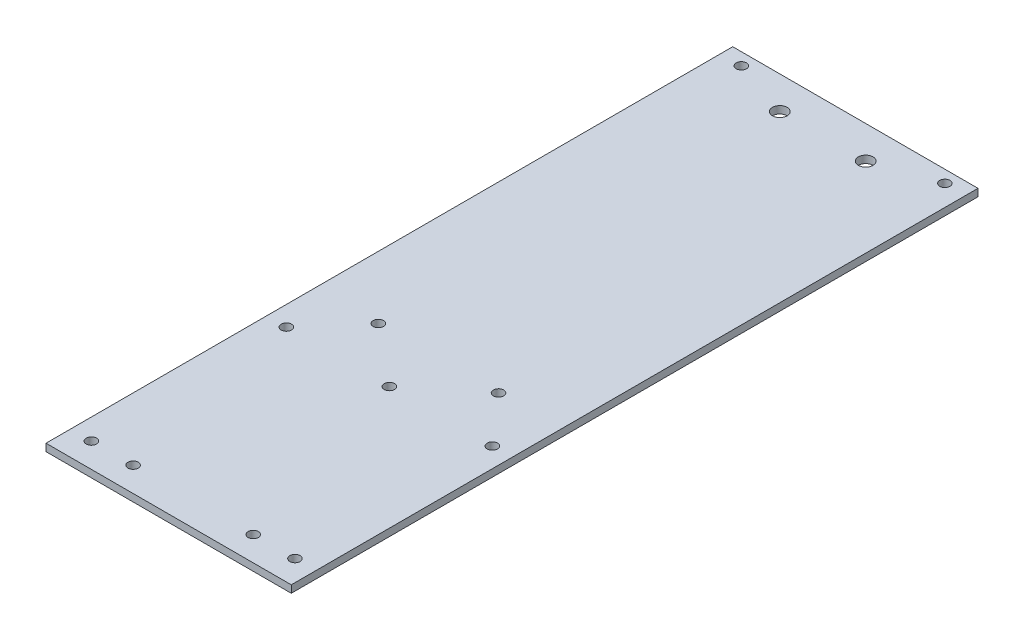
ISO-10303-21;
HEADER;
FILE_DESCRIPTION(('STEP AP214'),'2;1');
FILE_NAME('part.step','',(''),(''),'','','');
FILE_SCHEMA(('AUTOMOTIVE_DESIGN { 1 0 10303 214 1 1 1 1 }'));
ENDSEC;
DATA;
#1=APPLICATION_CONTEXT('core data for automotive mechanical design processes');
#2=APPLICATION_PROTOCOL_DEFINITION('international standard','automotive_design',2000,#1);
#3=PRODUCT_CONTEXT('',#1,'mechanical');
#4=PRODUCT('Part','Part','',(#3));
#5=PRODUCT_RELATED_PRODUCT_CATEGORY('part','',(#4));
#6=PRODUCT_DEFINITION_FORMATION('','',#4);
#7=PRODUCT_DEFINITION_CONTEXT('part definition',#1,'design');
#8=PRODUCT_DEFINITION('design','',#6,#7);
#9=PRODUCT_DEFINITION_SHAPE('','',#8);
#10=(LENGTH_UNIT() NAMED_UNIT(*) SI_UNIT(.MILLI.,.METRE.));
#11=(NAMED_UNIT(*) PLANE_ANGLE_UNIT() SI_UNIT($,.RADIAN.));
#12=(NAMED_UNIT(*) SI_UNIT($,.STERADIAN.) SOLID_ANGLE_UNIT());
#13=UNCERTAINTY_MEASURE_WITH_UNIT(LENGTH_MEASURE(1.E-05),#10,'distance_accuracy_value','');
#14=(GEOMETRIC_REPRESENTATION_CONTEXT(3) GLOBAL_UNCERTAINTY_ASSIGNED_CONTEXT((#13)) GLOBAL_UNIT_ASSIGNED_CONTEXT((#10,
#11,#12)) REPRESENTATION_CONTEXT('',''));
#15=CARTESIAN_POINT('',(0.,0.,0.));
#16=DIRECTION('',(0.,0.,1.));
#17=DIRECTION('',(1.,0.,0.));
#18=AXIS2_PLACEMENT_3D('',#15,#16,#17);
#19=CARTESIAN_POINT('',(0.,3.,0.));
#20=DIRECTION('',(0.,1.,0.));
#21=DIRECTION('',(0.,0.,1.));
#22=AXIS2_PLACEMENT_3D('',#19,#20,#21);
#23=PLANE('',#22);
#24=CARTESIAN_POINT('',(41.4999999999999,3.,-215.));
#25=DIRECTION('',(0.,1.,0.));
#26=DIRECTION('',(0.,0.,1.));
#27=AXIS2_PLACEMENT_3D('',#24,#25,#26);
#28=CIRCLE('',#27,2.09999999999999);
#29=CARTESIAN_POINT('',(41.4999999999999,3.,-212.9));
#30=VERTEX_POINT('',#29);
#31=EDGE_CURVE('E242',#30,#30,#28,.T.);
#32=ORIENTED_EDGE('',*,*,#31,.F.);
#33=EDGE_LOOP('',(#32));
#34=FACE_BOUND('',#33,.T.);
#35=CARTESIAN_POINT('',(-41.5000000000001,3.,-215.));
#36=DIRECTION('',(0.,1.,0.));
#37=DIRECTION('',(0.,0.,1.));
#38=AXIS2_PLACEMENT_3D('',#35,#36,#37);
#39=CIRCLE('',#38,2.09999999999999);
#40=CARTESIAN_POINT('',(-41.5000000000001,3.,-212.9));
#41=VERTEX_POINT('',#40);
#42=EDGE_CURVE('E252',#41,#41,#39,.T.);
#43=ORIENTED_EDGE('',*,*,#42,.F.);
#44=EDGE_LOOP('',(#43));
#45=FACE_BOUND('',#44,.T.);
#46=CARTESIAN_POINT('',(-17.5,3.,-206.7));
#47=DIRECTION('',(0.,1.,0.));
#48=DIRECTION('',(0.,0.,1.));
#49=AXIS2_PLACEMENT_3D('',#46,#47,#48);
#50=CIRCLE('',#49,3.);
#51=CARTESIAN_POINT('',(-17.5,3.,-203.7));
#52=VERTEX_POINT('',#51);
#53=EDGE_CURVE('E258',#52,#52,#50,.T.);
#54=ORIENTED_EDGE('',*,*,#53,.F.);
#55=EDGE_LOOP('',(#54));
#56=FACE_BOUND('',#55,.T.);
#57=CARTESIAN_POINT('',(17.5,3.,-206.7));
#58=DIRECTION('',(0.,1.,0.));
#59=DIRECTION('',(0.,0.,1.));
#60=AXIS2_PLACEMENT_3D('',#57,#58,#59);
#61=CIRCLE('',#60,3.);
#62=CARTESIAN_POINT('',(17.5,3.,-203.7));
#63=VERTEX_POINT('',#62);
#64=EDGE_CURVE('E93',#63,#63,#61,.T.);
#65=ORIENTED_EDGE('',*,*,#64,.F.);
#66=EDGE_LOOP('',(#65));
#67=FACE_BOUND('',#66,.T.);
#68=CARTESIAN_POINT('',(-24.5,3.,50.));
#69=DIRECTION('',(0.,1.,0.));
#70=DIRECTION('',(0.,0.,1.));
#71=AXIS2_PLACEMENT_3D('',#68,#69,#70);
#72=CIRCLE('',#71,2.1);
#73=CARTESIAN_POINT('',(-24.5,3.,52.1));
#74=VERTEX_POINT('',#73);
#75=EDGE_CURVE('E105',#74,#74,#72,.T.);
#76=ORIENTED_EDGE('',*,*,#75,.F.);
#77=EDGE_LOOP('',(#76));
#78=FACE_BOUND('',#77,.T.);
#79=CARTESIAN_POINT('',(24.5,3.,50.));
#80=DIRECTION('',(0.,1.,0.));
#81=DIRECTION('',(0.,0.,1.));
#82=AXIS2_PLACEMENT_3D('',#79,#80,#81);
#83=CIRCLE('',#82,2.1);
#84=CARTESIAN_POINT('',(24.5,3.,52.1));
#85=VERTEX_POINT('',#84);
#86=EDGE_CURVE('E111',#85,#85,#83,.T.);
#87=ORIENTED_EDGE('',*,*,#86,.F.);
#88=EDGE_LOOP('',(#87));
#89=FACE_BOUND('',#88,.T.);
#90=CARTESIAN_POINT('',(24.5,3.,-50.));
#91=DIRECTION('',(0.,1.,0.));
#92=DIRECTION('',(0.,0.,1.));
#93=AXIS2_PLACEMENT_3D('',#90,#91,#92);
#94=CIRCLE('',#93,2.1);
#95=CARTESIAN_POINT('',(24.5,3.,-47.9));
#96=VERTEX_POINT('',#95);
#97=EDGE_CURVE('E117',#96,#96,#94,.T.);
#98=ORIENTED_EDGE('',*,*,#97,.F.);
#99=EDGE_LOOP('',(#98));
#100=FACE_BOUND('',#99,.T.);
#101=CARTESIAN_POINT('',(-24.5,3.,-50.));
#102=DIRECTION('',(0.,1.,0.));
#103=DIRECTION('',(0.,0.,1.));
#104=AXIS2_PLACEMENT_3D('',#101,#102,#103);
#105=CIRCLE('',#104,2.1);
#106=CARTESIAN_POINT('',(-24.5,3.,-47.9));
#107=VERTEX_POINT('',#106);
#108=EDGE_CURVE('E123',#107,#107,#105,.T.);
#109=ORIENTED_EDGE('',*,*,#108,.F.);
#110=EDGE_LOOP('',(#109));
#111=FACE_BOUND('',#110,.T.);
#112=CARTESIAN_POINT('',(0.,3.,-30.));
#113=DIRECTION('',(0.,1.,0.));
#114=DIRECTION('',(0.,0.,1.));
#115=AXIS2_PLACEMENT_3D('',#112,#113,#114);
#116=CIRCLE('',#115,2.1);
#117=CARTESIAN_POINT('',(0.,3.,-27.9));
#118=VERTEX_POINT('',#117);
#119=EDGE_CURVE('E133',#118,#118,#116,.T.);
#120=ORIENTED_EDGE('',*,*,#119,.F.);
#121=EDGE_LOOP('',(#120));
#122=FACE_BOUND('',#121,.T.);
#123=CARTESIAN_POINT('',(-41.5,3.,50.));
#124=DIRECTION('',(0.,1.,0.));
#125=DIRECTION('',(0.,0.,1.));
#126=AXIS2_PLACEMENT_3D('',#123,#124,#125);
#127=CIRCLE('',#126,2.09999999999999);
#128=CARTESIAN_POINT('',(-41.5,3.,52.1));
#129=VERTEX_POINT('',#128);
#130=EDGE_CURVE('E145',#129,#129,#127,.T.);
#131=ORIENTED_EDGE('',*,*,#130,.F.);
#132=EDGE_LOOP('',(#131));
#133=FACE_BOUND('',#132,.T.);
#134=DIRECTION('',(0.,0.,-1.));
#135=VECTOR('',#134,1.);
#136=CARTESIAN_POINT('',(50.,3.,-60.));
#137=LINE('',#136,#135);
#138=CARTESIAN_POINT('',(50.,3.,60.));
#139=VERTEX_POINT('',#138);
#140=CARTESIAN_POINT('',(50.,3.,-220.));
#141=VERTEX_POINT('',#140);
#142=EDGE_CURVE('E80',#139,#141,#137,.T.);
#143=ORIENTED_EDGE('',*,*,#142,.T.);
#144=DIRECTION('',(1.,0.,0.));
#145=VECTOR('',#144,1.);
#146=CARTESIAN_POINT('',(-50.,3.,-220.));
#147=LINE('',#146,#145);
#148=CARTESIAN_POINT('',(-50.,3.,-220.));
#149=VERTEX_POINT('',#148);
#150=EDGE_CURVE('E83',#149,#141,#147,.T.);
#151=ORIENTED_EDGE('',*,*,#150,.F.);
#152=DIRECTION('',(0.,0.,1.));
#153=VECTOR('',#152,1.);
#154=CARTESIAN_POINT('',(-50.,3.,-60.));
#155=LINE('',#154,#153);
#156=CARTESIAN_POINT('',(-50.,3.,60.));
#157=VERTEX_POINT('',#156);
#158=EDGE_CURVE('E75',#149,#157,#155,.T.);
#159=ORIENTED_EDGE('',*,*,#158,.T.);
#160=DIRECTION('',(1.,0.,0.));
#161=VECTOR('',#160,1.);
#162=CARTESIAN_POINT('',(-50.,3.,60.));
#163=LINE('',#162,#161);
#164=EDGE_CURVE('E50',#157,#139,#163,.T.);
#165=ORIENTED_EDGE('',*,*,#164,.T.);
#166=EDGE_LOOP('',(#143,#151,#159,#165));
#167=FACE_BOUND('',#166,.T.);
#168=CARTESIAN_POINT('',(41.5,3.,50.));
#169=DIRECTION('',(0.,1.,0.));
#170=DIRECTION('',(0.,0.,-1.));
#171=AXIS2_PLACEMENT_3D('',#168,#169,#170);
#172=CIRCLE('',#171,2.09999999999999);
#173=CARTESIAN_POINT('',(41.5,3.,47.9));
#174=VERTEX_POINT('',#173);
#175=EDGE_CURVE('E151',#174,#174,#172,.T.);
#176=ORIENTED_EDGE('',*,*,#175,.F.);
#177=EDGE_LOOP('',(#176));
#178=FACE_BOUND('',#177,.T.);
#179=CARTESIAN_POINT('',(-42.,3.,-30.));
#180=DIRECTION('',(0.,1.,0.));
#181=DIRECTION('',(0.,0.,1.));
#182=AXIS2_PLACEMENT_3D('',#179,#180,#181);
#183=CIRCLE('',#182,2.1);
#184=CARTESIAN_POINT('',(-42.,3.,-27.9));
#185=VERTEX_POINT('',#184);
#186=EDGE_CURVE('E139',#185,#185,#183,.T.);
#187=ORIENTED_EDGE('',*,*,#186,.F.);
#188=EDGE_LOOP('',(#187));
#189=FACE_BOUND('',#188,.T.);
#190=CARTESIAN_POINT('',(42.,3.,-30.));
#191=DIRECTION('',(0.,1.,0.));
#192=DIRECTION('',(0.,0.,1.));
#193=AXIS2_PLACEMENT_3D('',#190,#191,#192);
#194=CIRCLE('',#193,2.1);
#195=CARTESIAN_POINT('',(42.,3.,-27.9));
#196=VERTEX_POINT('',#195);
#197=EDGE_CURVE('E127',#196,#196,#194,.T.);
#198=ORIENTED_EDGE('',*,*,#197,.F.);
#199=EDGE_LOOP('',(#198));
#200=FACE_BOUND('',#199,.T.);
#201=ADVANCED_FACE('F33',(#34,#45,#56,#67,#78,#89,#100,#111,#122,#133,#167,#178,#189,#200),#23,.T.);
#202=CARTESIAN_POINT('',(0.,0.,0.));
#203=DIRECTION('',(0.,1.,0.));
#204=DIRECTION('',(0.,0.,1.));
#205=AXIS2_PLACEMENT_3D('',#202,#203,#204);
#206=PLANE('',#205);
#207=CARTESIAN_POINT('',(41.4999999999999,0.,-215.));
#208=DIRECTION('',(0.,-1.,0.));
#209=DIRECTION('',(0.,0.,-1.));
#210=AXIS2_PLACEMENT_3D('',#207,#208,#209);
#211=CIRCLE('',#210,2.09999999999999);
#212=CARTESIAN_POINT('',(41.4999999999999,0.,-217.1));
#213=VERTEX_POINT('',#212);
#214=EDGE_CURVE('E245',#213,#213,#211,.T.);
#215=ORIENTED_EDGE('',*,*,#214,.F.);
#216=EDGE_LOOP('',(#215));
#217=FACE_BOUND('',#216,.T.);
#218=CARTESIAN_POINT('',(-41.5000000000001,0.,-215.));
#219=DIRECTION('',(0.,-1.,0.));
#220=DIRECTION('',(0.,0.,-1.));
#221=AXIS2_PLACEMENT_3D('',#218,#219,#220);
#222=CIRCLE('',#221,2.09999999999999);
#223=CARTESIAN_POINT('',(-41.5000000000001,0.,-217.1));
#224=VERTEX_POINT('',#223);
#225=EDGE_CURVE('E247',#224,#224,#222,.T.);
#226=ORIENTED_EDGE('',*,*,#225,.F.);
#227=EDGE_LOOP('',(#226));
#228=FACE_BOUND('',#227,.T.);
#229=CARTESIAN_POINT('',(-17.5,0.,-206.7));
#230=DIRECTION('',(0.,-1.,0.));
#231=DIRECTION('',(0.,0.,-1.));
#232=AXIS2_PLACEMENT_3D('',#229,#230,#231);
#233=CIRCLE('',#232,3.);
#234=CARTESIAN_POINT('',(-17.5,0.,-209.7));
#235=VERTEX_POINT('',#234);
#236=EDGE_CURVE('E255',#235,#235,#233,.T.);
#237=ORIENTED_EDGE('',*,*,#236,.F.);
#238=EDGE_LOOP('',(#237));
#239=FACE_BOUND('',#238,.T.);
#240=CARTESIAN_POINT('',(17.5,0.,-206.7));
#241=DIRECTION('',(0.,-1.,0.));
#242=DIRECTION('',(0.,0.,-1.));
#243=AXIS2_PLACEMENT_3D('',#240,#241,#242);
#244=CIRCLE('',#243,3.);
#245=CARTESIAN_POINT('',(17.5,0.,-209.7));
#246=VERTEX_POINT('',#245);
#247=EDGE_CURVE('E96',#246,#246,#244,.T.);
#248=ORIENTED_EDGE('',*,*,#247,.F.);
#249=EDGE_LOOP('',(#248));
#250=FACE_BOUND('',#249,.T.);
#251=CARTESIAN_POINT('',(-24.5,0.,50.));
#252=DIRECTION('',(0.,-1.,0.));
#253=DIRECTION('',(0.,0.,-1.));
#254=AXIS2_PLACEMENT_3D('',#251,#252,#253);
#255=CIRCLE('',#254,2.1);
#256=CARTESIAN_POINT('',(-24.5,0.,47.9));
#257=VERTEX_POINT('',#256);
#258=EDGE_CURVE('E102',#257,#257,#255,.T.);
#259=ORIENTED_EDGE('',*,*,#258,.F.);
#260=EDGE_LOOP('',(#259));
#261=FACE_BOUND('',#260,.T.);
#262=CARTESIAN_POINT('',(24.5,0.,50.));
#263=DIRECTION('',(0.,-1.,0.));
#264=DIRECTION('',(0.,0.,-1.));
#265=AXIS2_PLACEMENT_3D('',#262,#263,#264);
#266=CIRCLE('',#265,2.1);
#267=CARTESIAN_POINT('',(24.5,0.,47.9));
#268=VERTEX_POINT('',#267);
#269=EDGE_CURVE('E108',#268,#268,#266,.T.);
#270=ORIENTED_EDGE('',*,*,#269,.F.);
#271=EDGE_LOOP('',(#270));
#272=FACE_BOUND('',#271,.T.);
#273=CARTESIAN_POINT('',(24.5,0.,-50.));
#274=DIRECTION('',(0.,-1.,0.));
#275=DIRECTION('',(0.,0.,-1.));
#276=AXIS2_PLACEMENT_3D('',#273,#274,#275);
#277=CIRCLE('',#276,2.1);
#278=CARTESIAN_POINT('',(24.5,0.,-52.1));
#279=VERTEX_POINT('',#278);
#280=EDGE_CURVE('E114',#279,#279,#277,.T.);
#281=ORIENTED_EDGE('',*,*,#280,.F.);
#282=EDGE_LOOP('',(#281));
#283=FACE_BOUND('',#282,.T.);
#284=CARTESIAN_POINT('',(-24.5,0.,-50.));
#285=DIRECTION('',(0.,-1.,0.));
#286=DIRECTION('',(0.,0.,-1.));
#287=AXIS2_PLACEMENT_3D('',#284,#285,#286);
#288=CIRCLE('',#287,2.1);
#289=CARTESIAN_POINT('',(-24.5,0.,-52.1));
#290=VERTEX_POINT('',#289);
#291=EDGE_CURVE('E120',#290,#290,#288,.T.);
#292=ORIENTED_EDGE('',*,*,#291,.F.);
#293=EDGE_LOOP('',(#292));
#294=FACE_BOUND('',#293,.T.);
#295=DIRECTION('',(0.,0.,-1.));
#296=VECTOR('',#295,1.);
#297=CARTESIAN_POINT('',(50.,0.,-60.));
#298=LINE('',#297,#296);
#299=CARTESIAN_POINT('',(50.,0.,60.));
#300=VERTEX_POINT('',#299);
#301=CARTESIAN_POINT('',(50.,0.,-220.));
#302=VERTEX_POINT('',#301);
#303=EDGE_CURVE('E154',#300,#302,#298,.T.);
#304=ORIENTED_EDGE('',*,*,#303,.F.);
#305=DIRECTION('',(1.,0.,0.));
#306=VECTOR('',#305,1.);
#307=CARTESIAN_POINT('',(-50.,0.,60.));
#308=LINE('',#307,#306);
#309=CARTESIAN_POINT('',(-50.,0.,60.));
#310=VERTEX_POINT('',#309);
#311=EDGE_CURVE('E157',#310,#300,#308,.T.);
#312=ORIENTED_EDGE('',*,*,#311,.F.);
#313=DIRECTION('',(0.,0.,1.));
#314=VECTOR('',#313,1.);
#315=CARTESIAN_POINT('',(-50.,0.,-60.));
#316=LINE('',#315,#314);
#317=CARTESIAN_POINT('',(-50.,0.,-220.));
#318=VERTEX_POINT('',#317);
#319=EDGE_CURVE('E61',#318,#310,#316,.T.);
#320=ORIENTED_EDGE('',*,*,#319,.F.);
#321=DIRECTION('',(-1.,0.,0.));
#322=VECTOR('',#321,1.);
#323=CARTESIAN_POINT('',(-50.,0.,-220.));
#324=LINE('',#323,#322);
#325=EDGE_CURVE('E92',#302,#318,#324,.T.);
#326=ORIENTED_EDGE('',*,*,#325,.F.);
#327=EDGE_LOOP('',(#304,#312,#320,#326));
#328=FACE_BOUND('',#327,.T.);
#329=CARTESIAN_POINT('',(41.5,0.,50.));
#330=DIRECTION('',(0.,1.,0.));
#331=DIRECTION('',(0.,0.,-1.));
#332=AXIS2_PLACEMENT_3D('',#329,#330,#331);
#333=CIRCLE('',#332,2.09999999999999);
#334=CARTESIAN_POINT('',(41.5,0.,47.9));
#335=VERTEX_POINT('',#334);
#336=EDGE_CURVE('E148',#335,#335,#333,.T.);
#337=ORIENTED_EDGE('',*,*,#336,.T.);
#338=EDGE_LOOP('',(#337));
#339=FACE_BOUND('',#338,.T.);
#340=CARTESIAN_POINT('',(-41.5,0.,50.));
#341=DIRECTION('',(0.,1.,0.));
#342=DIRECTION('',(0.,0.,1.));
#343=AXIS2_PLACEMENT_3D('',#340,#341,#342);
#344=CIRCLE('',#343,2.09999999999999);
#345=CARTESIAN_POINT('',(-41.5,0.,52.1));
#346=VERTEX_POINT('',#345);
#347=EDGE_CURVE('E142',#346,#346,#344,.T.);
#348=ORIENTED_EDGE('',*,*,#347,.T.);
#349=EDGE_LOOP('',(#348));
#350=FACE_BOUND('',#349,.T.);
#351=CARTESIAN_POINT('',(-42.,0.,-30.));
#352=DIRECTION('',(0.,1.,0.));
#353=DIRECTION('',(0.,0.,1.));
#354=AXIS2_PLACEMENT_3D('',#351,#352,#353);
#355=CIRCLE('',#354,2.1);
#356=CARTESIAN_POINT('',(-42.,0.,-27.9));
#357=VERTEX_POINT('',#356);
#358=EDGE_CURVE('E136',#357,#357,#355,.T.);
#359=ORIENTED_EDGE('',*,*,#358,.T.);
#360=EDGE_LOOP('',(#359));
#361=FACE_BOUND('',#360,.T.);
#362=CARTESIAN_POINT('',(0.,0.,-30.));
#363=DIRECTION('',(0.,1.,0.));
#364=DIRECTION('',(0.,0.,1.));
#365=AXIS2_PLACEMENT_3D('',#362,#363,#364);
#366=CIRCLE('',#365,2.1);
#367=CARTESIAN_POINT('',(0.,0.,-27.9));
#368=VERTEX_POINT('',#367);
#369=EDGE_CURVE('E130',#368,#368,#366,.T.);
#370=ORIENTED_EDGE('',*,*,#369,.T.);
#371=EDGE_LOOP('',(#370));
#372=FACE_BOUND('',#371,.T.);
#373=CARTESIAN_POINT('',(42.,0.,-30.));
#374=DIRECTION('',(0.,1.,0.));
#375=DIRECTION('',(0.,0.,1.));
#376=AXIS2_PLACEMENT_3D('',#373,#374,#375);
#377=CIRCLE('',#376,2.1);
#378=CARTESIAN_POINT('',(42.,0.,-27.9));
#379=VERTEX_POINT('',#378);
#380=EDGE_CURVE('E126',#379,#379,#377,.T.);
#381=ORIENTED_EDGE('',*,*,#380,.T.);
#382=EDGE_LOOP('',(#381));
#383=FACE_BOUND('',#382,.T.);
#384=ADVANCED_FACE('F166',(#217,#228,#239,#250,#261,#272,#283,#294,#328,#339,#350,#361,#372,
#383),#206,.F.);
#385=CARTESIAN_POINT('',(50.,3.,-60.));
#386=DIRECTION('',(-1.,0.,0.));
#387=DIRECTION('',(0.,0.,1.));
#388=AXIS2_PLACEMENT_3D('',#385,#386,#387);
#389=PLANE('',#388);
#390=ORIENTED_EDGE('',*,*,#303,.T.);
#391=DIRECTION('',(0.,-1.,0.));
#392=VECTOR('',#391,1.);
#393=CARTESIAN_POINT('',(50.,0.,-220.));
#394=LINE('',#393,#392);
#395=EDGE_CURVE('E89',#141,#302,#394,.T.);
#396=ORIENTED_EDGE('',*,*,#395,.F.);
#397=ORIENTED_EDGE('',*,*,#142,.F.);
#398=DIRECTION('',(0.,-1.,0.));
#399=VECTOR('',#398,1.);
#400=CARTESIAN_POINT('',(50.,3.,60.));
#401=LINE('',#400,#399);
#402=EDGE_CURVE('E42',#139,#300,#401,.T.);
#403=ORIENTED_EDGE('',*,*,#402,.T.);
#404=EDGE_LOOP('',(#390,#396,#397,#403));
#405=FACE_BOUND('',#404,.T.);
#406=ADVANCED_FACE('F35',(#405),#389,.F.);
#407=CARTESIAN_POINT('',(-50.,3.,-60.));
#408=DIRECTION('',(1.,0.,0.));
#409=DIRECTION('',(0.,0.,-1.));
#410=AXIS2_PLACEMENT_3D('',#407,#408,#409);
#411=PLANE('',#410);
#412=ORIENTED_EDGE('',*,*,#319,.T.);
#413=DIRECTION('',(0.,-1.,0.));
#414=VECTOR('',#413,1.);
#415=CARTESIAN_POINT('',(-50.,3.,60.));
#416=LINE('',#415,#414);
#417=EDGE_CURVE('E11',#157,#310,#416,.T.);
#418=ORIENTED_EDGE('',*,*,#417,.F.);
#419=ORIENTED_EDGE('',*,*,#158,.F.);
#420=DIRECTION('',(0.,1.,0.));
#421=VECTOR('',#420,1.);
#422=CARTESIAN_POINT('',(-50.,0.,-220.));
#423=LINE('',#422,#421);
#424=EDGE_CURVE('E79',#318,#149,#423,.T.);
#425=ORIENTED_EDGE('',*,*,#424,.F.);
#426=EDGE_LOOP('',(#412,#418,#419,#425));
#427=FACE_BOUND('',#426,.T.);
#428=ADVANCED_FACE('F77',(#427),#411,.F.);
#429=CARTESIAN_POINT('',(-50.,3.,60.));
#430=DIRECTION('',(0.,0.,-1.));
#431=DIRECTION('',(-1.,0.,0.));
#432=AXIS2_PLACEMENT_3D('',#429,#430,#431);
#433=PLANE('',#432);
#434=ORIENTED_EDGE('',*,*,#311,.T.);
#435=ORIENTED_EDGE('',*,*,#402,.F.);
#436=ORIENTED_EDGE('',*,*,#164,.F.);
#437=ORIENTED_EDGE('',*,*,#417,.T.);
#438=EDGE_LOOP('',(#434,#435,#436,#437));
#439=FACE_BOUND('',#438,.T.);
#440=ADVANCED_FACE('F168',(#439),#433,.F.);
#441=CARTESIAN_POINT('',(41.5,3.,50.));
#442=DIRECTION('',(0.,-1.,0.));
#443=DIRECTION('',(0.,0.,-1.));
#444=AXIS2_PLACEMENT_3D('',#441,#442,#443);
#445=CYLINDRICAL_SURFACE('',#444,2.09999999999999);
#446=ORIENTED_EDGE('',*,*,#175,.T.);
#447=EDGE_LOOP('',(#446));
#448=FACE_BOUND('',#447,.T.);
#449=ORIENTED_EDGE('',*,*,#336,.F.);
#450=EDGE_LOOP('',(#449));
#451=FACE_BOUND('',#450,.T.);
#452=ADVANCED_FACE('F170',(#448,#451),#445,.F.);
#453=CARTESIAN_POINT('',(-41.5,3.,50.));
#454=DIRECTION('',(0.,-1.,0.));
#455=DIRECTION('',(0.,0.,-1.));
#456=AXIS2_PLACEMENT_3D('',#453,#454,#455);
#457=CYLINDRICAL_SURFACE('',#456,2.09999999999999);
#458=ORIENTED_EDGE('',*,*,#130,.T.);
#459=EDGE_LOOP('',(#458));
#460=FACE_BOUND('',#459,.T.);
#461=ORIENTED_EDGE('',*,*,#347,.F.);
#462=EDGE_LOOP('',(#461));
#463=FACE_BOUND('',#462,.T.);
#464=ADVANCED_FACE('F176',(#460,#463),#457,.F.);
#465=CARTESIAN_POINT('',(-42.,3.,-30.));
#466=DIRECTION('',(0.,-1.,0.));
#467=DIRECTION('',(0.,0.,-1.));
#468=AXIS2_PLACEMENT_3D('',#465,#466,#467);
#469=CYLINDRICAL_SURFACE('',#468,2.1);
#470=ORIENTED_EDGE('',*,*,#186,.T.);
#471=EDGE_LOOP('',(#470));
#472=FACE_BOUND('',#471,.T.);
#473=ORIENTED_EDGE('',*,*,#358,.F.);
#474=EDGE_LOOP('',(#473));
#475=FACE_BOUND('',#474,.T.);
#476=ADVANCED_FACE('F192',(#472,#475),#469,.F.);
#477=CARTESIAN_POINT('',(0.,3.,-30.));
#478=DIRECTION('',(0.,-1.,0.));
#479=DIRECTION('',(0.,0.,-1.));
#480=AXIS2_PLACEMENT_3D('',#477,#478,#479);
#481=CYLINDRICAL_SURFACE('',#480,2.1);
#482=ORIENTED_EDGE('',*,*,#119,.T.);
#483=EDGE_LOOP('',(#482));
#484=FACE_BOUND('',#483,.T.);
#485=ORIENTED_EDGE('',*,*,#369,.F.);
#486=EDGE_LOOP('',(#485));
#487=FACE_BOUND('',#486,.T.);
#488=ADVANCED_FACE('F196',(#484,#487),#481,.F.);
#489=CARTESIAN_POINT('',(42.,3.,-30.));
#490=DIRECTION('',(0.,-1.,0.));
#491=DIRECTION('',(0.,0.,-1.));
#492=AXIS2_PLACEMENT_3D('',#489,#490,#491);
#493=CYLINDRICAL_SURFACE('',#492,2.1);
#494=ORIENTED_EDGE('',*,*,#197,.T.);
#495=EDGE_LOOP('',(#494));
#496=FACE_BOUND('',#495,.T.);
#497=ORIENTED_EDGE('',*,*,#380,.F.);
#498=EDGE_LOOP('',(#497));
#499=FACE_BOUND('',#498,.T.);
#500=ADVANCED_FACE('F200',(#496,#499),#493,.F.);
#501=CARTESIAN_POINT('',(-24.5,10.,-50.));
#502=DIRECTION('',(0.,-1.,0.));
#503=DIRECTION('',(0.,0.,-1.));
#504=AXIS2_PLACEMENT_3D('',#501,#502,#503);
#505=CYLINDRICAL_SURFACE('',#504,2.1);
#506=ORIENTED_EDGE('',*,*,#108,.T.);
#507=EDGE_LOOP('',(#506));
#508=FACE_BOUND('',#507,.T.);
#509=ORIENTED_EDGE('',*,*,#291,.T.);
#510=EDGE_LOOP('',(#509));
#511=FACE_BOUND('',#510,.T.);
#512=ADVANCED_FACE('F204',(#508,#511),#505,.F.);
#513=CARTESIAN_POINT('',(24.5,10.,-50.));
#514=DIRECTION('',(0.,-1.,0.));
#515=DIRECTION('',(0.,0.,-1.));
#516=AXIS2_PLACEMENT_3D('',#513,#514,#515);
#517=CYLINDRICAL_SURFACE('',#516,2.1);
#518=ORIENTED_EDGE('',*,*,#97,.T.);
#519=EDGE_LOOP('',(#518));
#520=FACE_BOUND('',#519,.T.);
#521=ORIENTED_EDGE('',*,*,#280,.T.);
#522=EDGE_LOOP('',(#521));
#523=FACE_BOUND('',#522,.T.);
#524=ADVANCED_FACE('F208',(#520,#523),#517,.F.);
#525=CARTESIAN_POINT('',(24.5,10.,50.));
#526=DIRECTION('',(0.,-1.,0.));
#527=DIRECTION('',(0.,0.,-1.));
#528=AXIS2_PLACEMENT_3D('',#525,#526,#527);
#529=CYLINDRICAL_SURFACE('',#528,2.1);
#530=ORIENTED_EDGE('',*,*,#86,.T.);
#531=EDGE_LOOP('',(#530));
#532=FACE_BOUND('',#531,.T.);
#533=ORIENTED_EDGE('',*,*,#269,.T.);
#534=EDGE_LOOP('',(#533));
#535=FACE_BOUND('',#534,.T.);
#536=ADVANCED_FACE('F212',(#532,#535),#529,.F.);
#537=CARTESIAN_POINT('',(-24.5,10.,50.));
#538=DIRECTION('',(0.,-1.,0.));
#539=DIRECTION('',(0.,0.,-1.));
#540=AXIS2_PLACEMENT_3D('',#537,#538,#539);
#541=CYLINDRICAL_SURFACE('',#540,2.1);
#542=ORIENTED_EDGE('',*,*,#75,.T.);
#543=EDGE_LOOP('',(#542));
#544=FACE_BOUND('',#543,.T.);
#545=ORIENTED_EDGE('',*,*,#258,.T.);
#546=EDGE_LOOP('',(#545));
#547=FACE_BOUND('',#546,.T.);
#548=ADVANCED_FACE('F216',(#544,#547),#541,.F.);
#549=CARTESIAN_POINT('',(0.,0.,-220.));
#550=DIRECTION('',(0.,0.,-1.));
#551=DIRECTION('',(-1.,0.,0.));
#552=AXIS2_PLACEMENT_3D('',#549,#550,#551);
#553=PLANE('',#552);
#554=ORIENTED_EDGE('',*,*,#424,.T.);
#555=ORIENTED_EDGE('',*,*,#150,.T.);
#556=ORIENTED_EDGE('',*,*,#395,.T.);
#557=ORIENTED_EDGE('',*,*,#325,.T.);
#558=EDGE_LOOP('',(#554,#555,#556,#557));
#559=FACE_BOUND('',#558,.T.);
#560=ADVANCED_FACE('F91',(#559),#553,.T.);
#561=CARTESIAN_POINT('',(17.5,160.,-206.7));
#562=DIRECTION('',(0.,-1.,0.));
#563=DIRECTION('',(0.,0.,-1.));
#564=AXIS2_PLACEMENT_3D('',#561,#562,#563);
#565=CYLINDRICAL_SURFACE('',#564,3.);
#566=ORIENTED_EDGE('',*,*,#64,.T.);
#567=EDGE_LOOP('',(#566));
#568=FACE_BOUND('',#567,.T.);
#569=ORIENTED_EDGE('',*,*,#247,.T.);
#570=EDGE_LOOP('',(#569));
#571=FACE_BOUND('',#570,.T.);
#572=ADVANCED_FACE('F223',(#568,#571),#565,.F.);
#573=CARTESIAN_POINT('',(-17.5,160.,-206.7));
#574=DIRECTION('',(0.,-1.,0.));
#575=DIRECTION('',(0.,0.,-1.));
#576=AXIS2_PLACEMENT_3D('',#573,#574,#575);
#577=CYLINDRICAL_SURFACE('',#576,3.);
#578=ORIENTED_EDGE('',*,*,#53,.T.);
#579=EDGE_LOOP('',(#578));
#580=FACE_BOUND('',#579,.T.);
#581=ORIENTED_EDGE('',*,*,#236,.T.);
#582=EDGE_LOOP('',(#581));
#583=FACE_BOUND('',#582,.T.);
#584=ADVANCED_FACE('F226',(#580,#583),#577,.F.);
#585=CARTESIAN_POINT('',(-41.5000000000001,160.,-215.));
#586=DIRECTION('',(0.,-1.,0.));
#587=DIRECTION('',(0.,0.,-1.));
#588=AXIS2_PLACEMENT_3D('',#585,#586,#587);
#589=CYLINDRICAL_SURFACE('',#588,2.09999999999999);
#590=ORIENTED_EDGE('',*,*,#42,.T.);
#591=EDGE_LOOP('',(#590));
#592=FACE_BOUND('',#591,.T.);
#593=ORIENTED_EDGE('',*,*,#225,.T.);
#594=EDGE_LOOP('',(#593));
#595=FACE_BOUND('',#594,.T.);
#596=ADVANCED_FACE('F230',(#592,#595),#589,.F.);
#597=CARTESIAN_POINT('',(41.4999999999999,160.,-215.));
#598=DIRECTION('',(0.,-1.,0.));
#599=DIRECTION('',(0.,0.,-1.));
#600=AXIS2_PLACEMENT_3D('',#597,#598,#599);
#601=CYLINDRICAL_SURFACE('',#600,2.09999999999999);
#602=ORIENTED_EDGE('',*,*,#31,.T.);
#603=EDGE_LOOP('',(#602));
#604=FACE_BOUND('',#603,.T.);
#605=ORIENTED_EDGE('',*,*,#214,.T.);
#606=EDGE_LOOP('',(#605));
#607=FACE_BOUND('',#606,.T.);
#608=ADVANCED_FACE('F234',(#604,#607),#601,.F.);
#609=CLOSED_SHELL('',(#201,#384,#406,#428,#440,#452,#464,#476,#488,#500,#512,#524,#536,#548,
#560,#572,#584,#596,#608));
#610=MANIFOLD_SOLID_BREP('B2',#609);
#611=ADVANCED_BREP_SHAPE_REPRESENTATION('',(#18,#610),#14);
#612=SHAPE_DEFINITION_REPRESENTATION(#9,#611);
ENDSEC;
END-ISO-10303-21;
